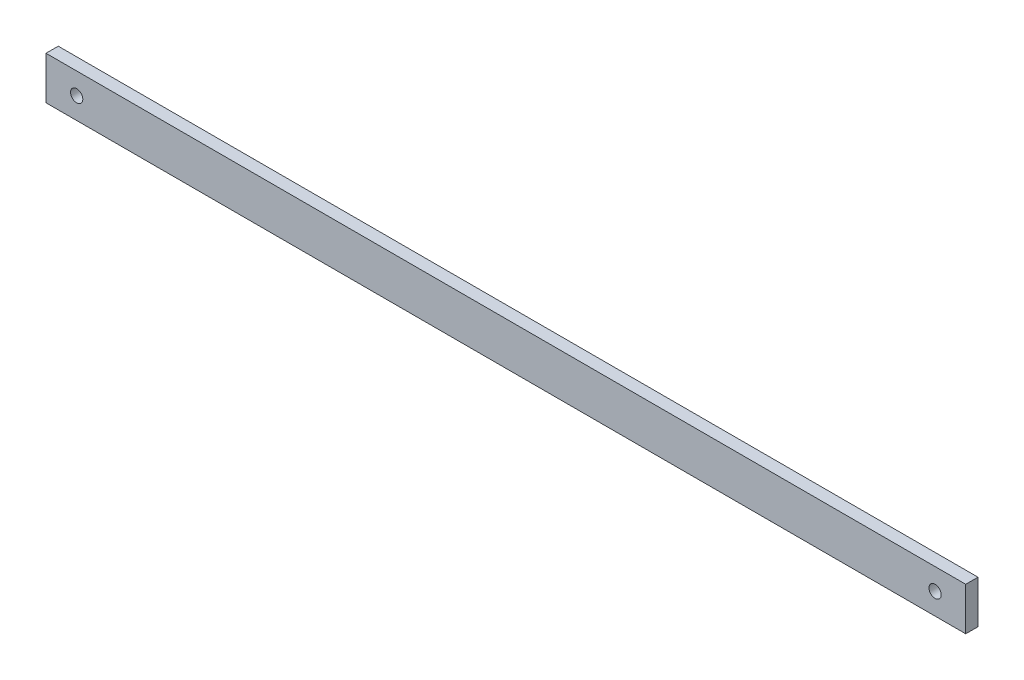
ISO-10303-21;
HEADER;
FILE_DESCRIPTION(('STEP AP214'),'2;1');
FILE_NAME('part.step','',(''),(''),'','','');
FILE_SCHEMA(('AUTOMOTIVE_DESIGN { 1 0 10303 214 1 1 1 1 }'));
ENDSEC;
DATA;
#1=APPLICATION_CONTEXT('core data for automotive mechanical design processes');
#2=APPLICATION_PROTOCOL_DEFINITION('international standard','automotive_design',2000,#1);
#3=PRODUCT_CONTEXT('',#1,'mechanical');
#4=PRODUCT('Part','Part','',(#3));
#5=PRODUCT_RELATED_PRODUCT_CATEGORY('part','',(#4));
#6=PRODUCT_DEFINITION_FORMATION('','',#4);
#7=PRODUCT_DEFINITION_CONTEXT('part definition',#1,'design');
#8=PRODUCT_DEFINITION('design','',#6,#7);
#9=PRODUCT_DEFINITION_SHAPE('','',#8);
#10=(LENGTH_UNIT() NAMED_UNIT(*) SI_UNIT(.MILLI.,.METRE.));
#11=(NAMED_UNIT(*) PLANE_ANGLE_UNIT() SI_UNIT($,.RADIAN.));
#12=(NAMED_UNIT(*) SI_UNIT($,.STERADIAN.) SOLID_ANGLE_UNIT());
#13=UNCERTAINTY_MEASURE_WITH_UNIT(LENGTH_MEASURE(1.E-05),#10,'distance_accuracy_value','');
#14=(GEOMETRIC_REPRESENTATION_CONTEXT(3) GLOBAL_UNCERTAINTY_ASSIGNED_CONTEXT((#13)) GLOBAL_UNIT_ASSIGNED_CONTEXT((#10,
#11,#12)) REPRESENTATION_CONTEXT('',''));
#15=CARTESIAN_POINT('',(0.,0.,0.));
#16=DIRECTION('',(0.,0.,1.));
#17=DIRECTION('',(1.,0.,0.));
#18=AXIS2_PLACEMENT_3D('',#15,#16,#17);
#19=CARTESIAN_POINT('',(0.,0.,2.));
#20=DIRECTION('',(0.,0.,-1.));
#21=DIRECTION('',(-1.,0.,0.));
#22=AXIS2_PLACEMENT_3D('',#19,#20,#21);
#23=PLANE('',#22);
#24=DIRECTION('',(0.,1.,0.));
#25=VECTOR('',#24,1.);
#26=CARTESIAN_POINT('',(75.,-3.5,2.));
#27=LINE('',#26,#25);
#28=CARTESIAN_POINT('',(75.,-3.5,2.));
#29=VERTEX_POINT('',#28);
#30=CARTESIAN_POINT('',(75.,3.5,2.));
#31=VERTEX_POINT('',#30);
#32=EDGE_CURVE('E98',#29,#31,#27,.T.);
#33=ORIENTED_EDGE('',*,*,#32,.T.);
#34=DIRECTION('',(-1.,0.,0.));
#35=VECTOR('',#34,1.);
#36=CARTESIAN_POINT('',(-75.,3.5,2.));
#37=LINE('',#36,#35);
#38=CARTESIAN_POINT('',(-75.,3.5,2.));
#39=VERTEX_POINT('',#38);
#40=EDGE_CURVE('E93',#31,#39,#37,.T.);
#41=ORIENTED_EDGE('',*,*,#40,.T.);
#42=DIRECTION('',(0.,-1.,0.));
#43=VECTOR('',#42,1.);
#44=CARTESIAN_POINT('',(-75.,-3.5,2.));
#45=LINE('',#44,#43);
#46=CARTESIAN_POINT('',(-75.,-3.5,2.));
#47=VERTEX_POINT('',#46);
#48=EDGE_CURVE('E96',#39,#47,#45,.T.);
#49=ORIENTED_EDGE('',*,*,#48,.T.);
#50=DIRECTION('',(1.,0.,0.));
#51=VECTOR('',#50,1.);
#52=CARTESIAN_POINT('',(-75.,-3.5,2.));
#53=LINE('',#52,#51);
#54=EDGE_CURVE('E63',#47,#29,#53,.T.);
#55=ORIENTED_EDGE('',*,*,#54,.T.);
#56=EDGE_LOOP('',(#33,#41,#49,#55));
#57=FACE_BOUND('',#56,.T.);
#58=CARTESIAN_POINT('',(-70.,0.,2.));
#59=DIRECTION('',(0.,0.,1.));
#60=DIRECTION('',(1.,0.,0.));
#61=AXIS2_PLACEMENT_3D('',#58,#59,#60);
#62=CIRCLE('',#61,0.999999999999998);
#63=CARTESIAN_POINT('',(-69.,0.,2.));
#64=VERTEX_POINT('',#63);
#65=EDGE_CURVE('E118',#64,#64,#62,.T.);
#66=ORIENTED_EDGE('',*,*,#65,.F.);
#67=EDGE_LOOP('',(#66));
#68=FACE_BOUND('',#67,.T.);
#69=CARTESIAN_POINT('',(70.,0.,2.));
#70=DIRECTION('',(0.,0.,1.));
#71=DIRECTION('',(-1.,0.,0.));
#72=AXIS2_PLACEMENT_3D('',#69,#70,#71);
#73=CIRCLE('',#72,0.999999999999998);
#74=CARTESIAN_POINT('',(69.,0.,2.));
#75=VERTEX_POINT('',#74);
#76=EDGE_CURVE('E140',#75,#75,#73,.T.);
#77=ORIENTED_EDGE('',*,*,#76,.F.);
#78=EDGE_LOOP('',(#77));
#79=FACE_BOUND('',#78,.T.);
#80=ADVANCED_FACE('F45',(#57,#68,#79),#23,.F.);
#81=CARTESIAN_POINT('',(0.,0.,0.));
#82=DIRECTION('',(0.,0.,-1.));
#83=DIRECTION('',(-1.,0.,0.));
#84=AXIS2_PLACEMENT_3D('',#81,#82,#83);
#85=PLANE('',#84);
#86=CARTESIAN_POINT('',(-70.,0.,0.));
#87=DIRECTION('',(0.,0.,1.));
#88=DIRECTION('',(1.,0.,0.));
#89=AXIS2_PLACEMENT_3D('',#86,#87,#88);
#90=CIRCLE('',#89,0.999999999999998);
#91=CARTESIAN_POINT('',(-69.,0.,0.));
#92=VERTEX_POINT('',#91);
#93=EDGE_CURVE('E136',#92,#92,#90,.T.);
#94=ORIENTED_EDGE('',*,*,#93,.T.);
#95=EDGE_LOOP('',(#94));
#96=FACE_BOUND('',#95,.T.);
#97=DIRECTION('',(0.,1.,0.));
#98=VECTOR('',#97,1.);
#99=CARTESIAN_POINT('',(75.,-3.5,0.));
#100=LINE('',#99,#98);
#101=CARTESIAN_POINT('',(75.,-3.5,0.));
#102=VERTEX_POINT('',#101);
#103=CARTESIAN_POINT('',(75.,3.5,0.));
#104=VERTEX_POINT('',#103);
#105=EDGE_CURVE('E114',#102,#104,#100,.T.);
#106=ORIENTED_EDGE('',*,*,#105,.F.);
#107=DIRECTION('',(1.,0.,0.));
#108=VECTOR('',#107,1.);
#109=CARTESIAN_POINT('',(-75.,-3.5,0.));
#110=LINE('',#109,#108);
#111=CARTESIAN_POINT('',(-75.,-3.5,0.));
#112=VERTEX_POINT('',#111);
#113=EDGE_CURVE('E86',#112,#102,#110,.T.);
#114=ORIENTED_EDGE('',*,*,#113,.F.);
#115=DIRECTION('',(0.,-1.,0.));
#116=VECTOR('',#115,1.);
#117=CARTESIAN_POINT('',(-75.,-3.5,0.));
#118=LINE('',#117,#116);
#119=CARTESIAN_POINT('',(-75.,3.5,0.));
#120=VERTEX_POINT('',#119);
#121=EDGE_CURVE('E80',#120,#112,#118,.T.);
#122=ORIENTED_EDGE('',*,*,#121,.F.);
#123=DIRECTION('',(-1.,0.,0.));
#124=VECTOR('',#123,1.);
#125=CARTESIAN_POINT('',(-75.,3.5,0.));
#126=LINE('',#125,#124);
#127=EDGE_CURVE('E103',#104,#120,#126,.T.);
#128=ORIENTED_EDGE('',*,*,#127,.F.);
#129=EDGE_LOOP('',(#106,#114,#122,#128));
#130=FACE_BOUND('',#129,.T.);
#131=CARTESIAN_POINT('',(70.,0.,0.));
#132=DIRECTION('',(0.,0.,1.));
#133=DIRECTION('',(-1.,0.,0.));
#134=AXIS2_PLACEMENT_3D('',#131,#132,#133);
#135=CIRCLE('',#134,0.999999999999998);
#136=CARTESIAN_POINT('',(69.,0.,0.));
#137=VERTEX_POINT('',#136);
#138=EDGE_CURVE('E144',#137,#137,#135,.T.);
#139=ORIENTED_EDGE('',*,*,#138,.T.);
#140=EDGE_LOOP('',(#139));
#141=FACE_BOUND('',#140,.T.);
#142=ADVANCED_FACE('F131',(#96,#130,#141),#85,.T.);
#143=CARTESIAN_POINT('',(75.,-3.5,2.));
#144=DIRECTION('',(-1.,0.,0.));
#145=DIRECTION('',(0.,0.,1.));
#146=AXIS2_PLACEMENT_3D('',#143,#144,#145);
#147=PLANE('',#146);
#148=ORIENTED_EDGE('',*,*,#105,.T.);
#149=DIRECTION('',(0.,0.,-1.));
#150=VECTOR('',#149,1.);
#151=CARTESIAN_POINT('',(75.,3.5,2.));
#152=LINE('',#151,#150);
#153=EDGE_CURVE('E11',#31,#104,#152,.T.);
#154=ORIENTED_EDGE('',*,*,#153,.F.);
#155=ORIENTED_EDGE('',*,*,#32,.F.);
#156=DIRECTION('',(0.,0.,-1.));
#157=VECTOR('',#156,1.);
#158=CARTESIAN_POINT('',(75.,-3.5,2.));
#159=LINE('',#158,#157);
#160=EDGE_CURVE('E110',#29,#102,#159,.T.);
#161=ORIENTED_EDGE('',*,*,#160,.T.);
#162=EDGE_LOOP('',(#148,#154,#155,#161));
#163=FACE_BOUND('',#162,.T.);
#164=ADVANCED_FACE('F47',(#163),#147,.F.);
#165=CARTESIAN_POINT('',(-75.,3.5,2.));
#166=DIRECTION('',(0.,-1.,0.));
#167=DIRECTION('',(0.,0.,-1.));
#168=AXIS2_PLACEMENT_3D('',#165,#166,#167);
#169=PLANE('',#168);
#170=ORIENTED_EDGE('',*,*,#127,.T.);
#171=DIRECTION('',(0.,0.,-1.));
#172=VECTOR('',#171,1.);
#173=CARTESIAN_POINT('',(-75.,3.5,2.));
#174=LINE('',#173,#172);
#175=EDGE_CURVE('E55',#39,#120,#174,.T.);
#176=ORIENTED_EDGE('',*,*,#175,.F.);
#177=ORIENTED_EDGE('',*,*,#40,.F.);
#178=ORIENTED_EDGE('',*,*,#153,.T.);
#179=EDGE_LOOP('',(#170,#176,#177,#178));
#180=FACE_BOUND('',#179,.T.);
#181=ADVANCED_FACE('F102',(#180),#169,.F.);
#182=CARTESIAN_POINT('',(-75.,-3.5,2.));
#183=DIRECTION('',(1.,0.,0.));
#184=DIRECTION('',(0.,0.,-1.));
#185=AXIS2_PLACEMENT_3D('',#182,#183,#184);
#186=PLANE('',#185);
#187=ORIENTED_EDGE('',*,*,#121,.T.);
#188=DIRECTION('',(0.,0.,-1.));
#189=VECTOR('',#188,1.);
#190=CARTESIAN_POINT('',(-75.,-3.5,2.));
#191=LINE('',#190,#189);
#192=EDGE_CURVE('E105',#47,#112,#191,.T.);
#193=ORIENTED_EDGE('',*,*,#192,.F.);
#194=ORIENTED_EDGE('',*,*,#48,.F.);
#195=ORIENTED_EDGE('',*,*,#175,.T.);
#196=EDGE_LOOP('',(#187,#193,#194,#195));
#197=FACE_BOUND('',#196,.T.);
#198=ADVANCED_FACE('F106',(#197),#186,.F.);
#199=CARTESIAN_POINT('',(-75.,-3.5,2.));
#200=DIRECTION('',(0.,1.,0.));
#201=DIRECTION('',(0.,0.,1.));
#202=AXIS2_PLACEMENT_3D('',#199,#200,#201);
#203=PLANE('',#202);
#204=ORIENTED_EDGE('',*,*,#113,.T.);
#205=ORIENTED_EDGE('',*,*,#160,.F.);
#206=ORIENTED_EDGE('',*,*,#54,.F.);
#207=ORIENTED_EDGE('',*,*,#192,.T.);
#208=EDGE_LOOP('',(#204,#205,#206,#207));
#209=FACE_BOUND('',#208,.T.);
#210=ADVANCED_FACE('F128',(#209),#203,.F.);
#211=CARTESIAN_POINT('',(-70.,0.,2.));
#212=DIRECTION('',(0.,0.,-1.));
#213=DIRECTION('',(-1.,0.,0.));
#214=AXIS2_PLACEMENT_3D('',#211,#212,#213);
#215=CYLINDRICAL_SURFACE('',#214,0.999999999999998);
#216=ORIENTED_EDGE('',*,*,#65,.T.);
#217=EDGE_LOOP('',(#216));
#218=FACE_BOUND('',#217,.T.);
#219=ORIENTED_EDGE('',*,*,#93,.F.);
#220=EDGE_LOOP('',(#219));
#221=FACE_BOUND('',#220,.T.);
#222=ADVANCED_FACE('F163',(#218,#221),#215,.F.);
#223=CARTESIAN_POINT('',(70.,0.,2.));
#224=DIRECTION('',(0.,0.,-1.));
#225=DIRECTION('',(-1.,0.,0.));
#226=AXIS2_PLACEMENT_3D('',#223,#224,#225);
#227=CYLINDRICAL_SURFACE('',#226,0.999999999999998);
#228=ORIENTED_EDGE('',*,*,#76,.T.);
#229=EDGE_LOOP('',(#228));
#230=FACE_BOUND('',#229,.T.);
#231=ORIENTED_EDGE('',*,*,#138,.F.);
#232=EDGE_LOOP('',(#231));
#233=FACE_BOUND('',#232,.T.);
#234=ADVANCED_FACE('F152',(#230,#233),#227,.F.);
#235=CLOSED_SHELL('',(#80,#142,#164,#181,#198,#210,#222,#234));
#236=MANIFOLD_SOLID_BREP('B2',#235);
#237=ADVANCED_BREP_SHAPE_REPRESENTATION('',(#18,#236),#14);
#238=SHAPE_DEFINITION_REPRESENTATION(#9,#237);
ENDSEC;
END-ISO-10303-21;
